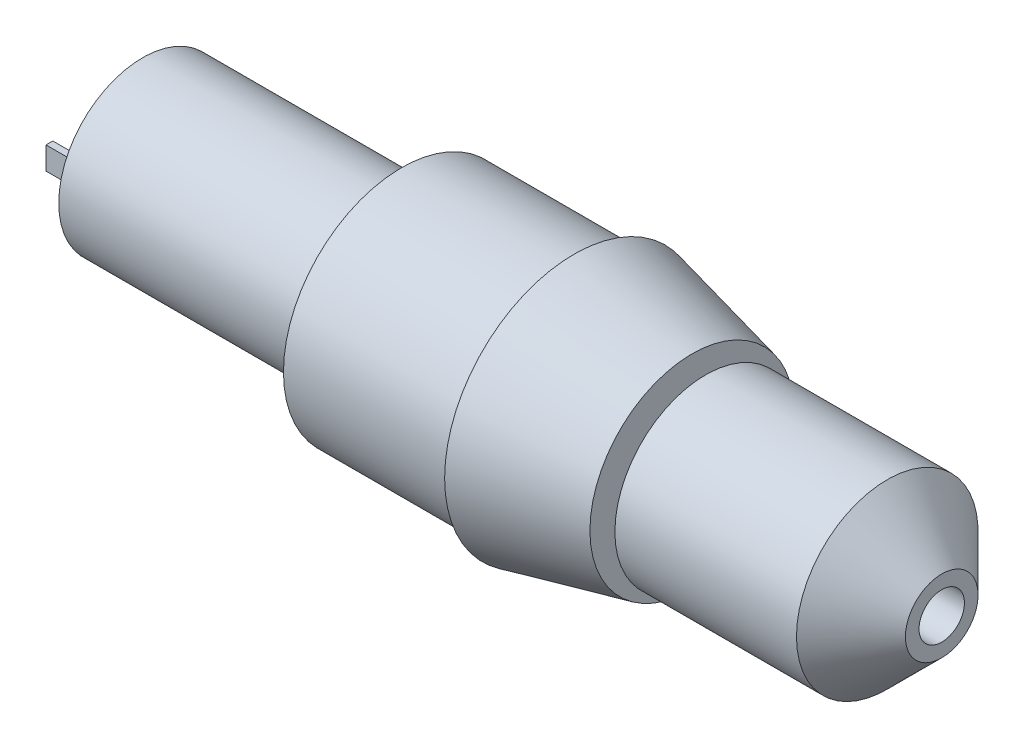
ISO-10303-21;
HEADER;
FILE_DESCRIPTION(('STEP AP214'),'2;1');
FILE_NAME('part.step','',(''),(''),'','','');
FILE_SCHEMA(('AUTOMOTIVE_DESIGN { 1 0 10303 214 1 1 1 1 }'));
ENDSEC;
DATA;
#1=APPLICATION_CONTEXT('core data for automotive mechanical design processes');
#2=APPLICATION_PROTOCOL_DEFINITION('international standard','automotive_design',2000,#1);
#3=PRODUCT_CONTEXT('',#1,'mechanical');
#4=PRODUCT('Part','Part','',(#3));
#5=PRODUCT_RELATED_PRODUCT_CATEGORY('part','',(#4));
#6=PRODUCT_DEFINITION_FORMATION('','',#4);
#7=PRODUCT_DEFINITION_CONTEXT('part definition',#1,'design');
#8=PRODUCT_DEFINITION('design','',#6,#7);
#9=PRODUCT_DEFINITION_SHAPE('','',#8);
#10=(LENGTH_UNIT() NAMED_UNIT(*) SI_UNIT(.MILLI.,.METRE.));
#11=(NAMED_UNIT(*) PLANE_ANGLE_UNIT() SI_UNIT($,.RADIAN.));
#12=(NAMED_UNIT(*) SI_UNIT($,.STERADIAN.) SOLID_ANGLE_UNIT());
#13=UNCERTAINTY_MEASURE_WITH_UNIT(LENGTH_MEASURE(1.E-05),#10,'distance_accuracy_value','');
#14=(GEOMETRIC_REPRESENTATION_CONTEXT(3) GLOBAL_UNCERTAINTY_ASSIGNED_CONTEXT((#13)) GLOBAL_UNIT_ASSIGNED_CONTEXT((#10,
#11,#12)) REPRESENTATION_CONTEXT('',''));
#15=CARTESIAN_POINT('',(0.,0.,0.));
#16=DIRECTION('',(0.,0.,1.));
#17=DIRECTION('',(1.,0.,0.));
#18=AXIS2_PLACEMENT_3D('',#15,#16,#17);
#19=CARTESIAN_POINT('',(0.,0.,0.));
#20=DIRECTION('',(1.,0.,0.));
#21=DIRECTION('',(0.,0.,-1.));
#22=AXIS2_PLACEMENT_3D('',#19,#20,#21);
#23=PLANE('',#22);
#24=DIRECTION('',(0.,1.,0.));
#25=VECTOR('',#24,1.);
#26=CARTESIAN_POINT('',(0.,-2.5,-9.80665286859409));
#27=LINE('',#26,#25);
#28=CARTESIAN_POINT('',(0.,-2.5,-9.80665286859409));
#29=VERTEX_POINT('',#28);
#30=CARTESIAN_POINT('',(0.,2.5,-9.80665286859409));
#31=VERTEX_POINT('',#30);
#32=EDGE_CURVE('E120',#29,#31,#27,.T.);
#33=ORIENTED_EDGE('',*,*,#32,.F.);
#34=DIRECTION('',(0.,0.,1.));
#35=VECTOR('',#34,1.);
#36=CARTESIAN_POINT('',(0.,-2.5,-11.3066528685941));
#37=LINE('',#36,#35);
#38=CARTESIAN_POINT('',(0.,-2.5,-11.3066528685941));
#39=VERTEX_POINT('',#38);
#40=EDGE_CURVE('E133',#39,#29,#37,.T.);
#41=ORIENTED_EDGE('',*,*,#40,.F.);
#42=DIRECTION('',(0.,-1.,0.));
#43=VECTOR('',#42,1.);
#44=CARTESIAN_POINT('',(0.,-2.5,-11.3066528685941));
#45=LINE('',#44,#43);
#46=CARTESIAN_POINT('',(0.,2.5,-11.3066528685941));
#47=VERTEX_POINT('',#46);
#48=EDGE_CURVE('E142',#47,#39,#45,.T.);
#49=ORIENTED_EDGE('',*,*,#48,.F.);
#50=DIRECTION('',(0.,0.,-1.));
#51=VECTOR('',#50,1.);
#52=CARTESIAN_POINT('',(0.,2.5,-11.3066528685941));
#53=LINE('',#52,#51);
#54=EDGE_CURVE('E123',#31,#47,#53,.T.);
#55=ORIENTED_EDGE('',*,*,#54,.F.);
#56=EDGE_LOOP('',(#33,#41,#49,#55));
#57=FACE_BOUND('',#56,.T.);
#58=CARTESIAN_POINT('',(0.,0.,0.));
#59=DIRECTION('',(-1.,0.,0.));
#60=DIRECTION('',(0.,0.,1.));
#61=AXIS2_PLACEMENT_3D('',#58,#59,#60);
#62=CIRCLE('',#61,18.5);
#63=CARTESIAN_POINT('',(0.,0.,18.5));
#64=VERTEX_POINT('',#63);
#65=EDGE_CURVE('E11',#64,#64,#62,.T.);
#66=ORIENTED_EDGE('',*,*,#65,.T.);
#67=EDGE_LOOP('',(#66));
#68=FACE_BOUND('',#67,.T.);
#69=DIRECTION('',(0.,1.,0.));
#70=VECTOR('',#69,1.);
#71=CARTESIAN_POINT('',(0.,-2.5,11.3066528685941));
#72=LINE('',#71,#70);
#73=CARTESIAN_POINT('',(0.,-2.5,11.3066528685941));
#74=VERTEX_POINT('',#73);
#75=CARTESIAN_POINT('',(0.,2.5,11.3066528685941));
#76=VERTEX_POINT('',#75);
#77=EDGE_CURVE('E119',#74,#76,#72,.T.);
#78=ORIENTED_EDGE('',*,*,#77,.F.);
#79=DIRECTION('',(0.,0.,1.));
#80=VECTOR('',#79,1.);
#81=CARTESIAN_POINT('',(0.,-2.5,11.3066528685941));
#82=LINE('',#81,#80);
#83=CARTESIAN_POINT('',(0.,-2.5,9.80665286859409));
#84=VERTEX_POINT('',#83);
#85=EDGE_CURVE('E116',#84,#74,#82,.T.);
#86=ORIENTED_EDGE('',*,*,#85,.F.);
#87=DIRECTION('',(0.,-1.,0.));
#88=VECTOR('',#87,1.);
#89=CARTESIAN_POINT('',(0.,-2.5,9.80665286859409));
#90=LINE('',#89,#88);
#91=CARTESIAN_POINT('',(0.,2.5,9.80665286859409));
#92=VERTEX_POINT('',#91);
#93=EDGE_CURVE('E54',#92,#84,#90,.T.);
#94=ORIENTED_EDGE('',*,*,#93,.F.);
#95=DIRECTION('',(0.,0.,-1.));
#96=VECTOR('',#95,1.);
#97=CARTESIAN_POINT('',(0.,2.5,11.3066528685941));
#98=LINE('',#97,#96);
#99=EDGE_CURVE('E49',#76,#92,#98,.T.);
#100=ORIENTED_EDGE('',*,*,#99,.F.);
#101=EDGE_LOOP('',(#78,#86,#94,#100));
#102=FACE_BOUND('',#101,.T.);
#103=ADVANCED_FACE('F35',(#57,#68,#102),#23,.F.);
#104=CARTESIAN_POINT('',(0.,0.,0.));
#105=DIRECTION('',(-1.,0.,0.));
#106=DIRECTION('',(0.,0.,1.));
#107=AXIS2_PLACEMENT_3D('',#104,#105,#106);
#108=CYLINDRICAL_SURFACE('',#107,18.5);
#109=ORIENTED_EDGE('',*,*,#65,.F.);
#110=EDGE_LOOP('',(#109));
#111=FACE_BOUND('',#110,.T.);
#112=CARTESIAN_POINT('',(57.,0.,0.));
#113=DIRECTION('',(-1.,0.,0.));
#114=DIRECTION('',(0.,0.,1.));
#115=AXIS2_PLACEMENT_3D('',#112,#113,#114);
#116=CIRCLE('',#115,18.5);
#117=CARTESIAN_POINT('',(57.,0.,18.5));
#118=VERTEX_POINT('',#117);
#119=EDGE_CURVE('E42',#118,#118,#116,.T.);
#120=ORIENTED_EDGE('',*,*,#119,.T.);
#121=EDGE_LOOP('',(#120));
#122=FACE_BOUND('',#121,.T.);
#123=ADVANCED_FACE('F193',(#111,#122),#108,.T.);
#124=CARTESIAN_POINT('',(57.,18.5,0.));
#125=DIRECTION('',(1.,0.,0.));
#126=DIRECTION('',(0.,0.,-1.));
#127=AXIS2_PLACEMENT_3D('',#124,#125,#126);
#128=PLANE('',#127);
#129=ORIENTED_EDGE('',*,*,#119,.F.);
#130=EDGE_LOOP('',(#129));
#131=FACE_BOUND('',#130,.T.);
#132=CARTESIAN_POINT('',(57.,0.,0.));
#133=DIRECTION('',(-1.,0.,0.));
#134=DIRECTION('',(0.,0.,1.));
#135=AXIS2_PLACEMENT_3D('',#132,#133,#134);
#136=CIRCLE('',#135,26.);
#137=CARTESIAN_POINT('',(57.,0.,26.));
#138=VERTEX_POINT('',#137);
#139=EDGE_CURVE('E188',#138,#138,#136,.T.);
#140=ORIENTED_EDGE('',*,*,#139,.T.);
#141=EDGE_LOOP('',(#140));
#142=FACE_BOUND('',#141,.T.);
#143=ADVANCED_FACE('F195',(#131,#142),#128,.F.);
#144=CARTESIAN_POINT('',(0.,0.,0.));
#145=DIRECTION('',(-1.,0.,0.));
#146=DIRECTION('',(0.,0.,1.));
#147=AXIS2_PLACEMENT_3D('',#144,#145,#146);
#148=CYLINDRICAL_SURFACE('',#147,26.);
#149=ORIENTED_EDGE('',*,*,#139,.F.);
#150=EDGE_LOOP('',(#149));
#151=FACE_BOUND('',#150,.T.);
#152=CARTESIAN_POINT('',(95.,0.,0.));
#153=DIRECTION('',(-1.,0.,0.));
#154=DIRECTION('',(0.,0.,1.));
#155=AXIS2_PLACEMENT_3D('',#152,#153,#154);
#156=CIRCLE('',#155,26.);
#157=CARTESIAN_POINT('',(95.,0.,26.));
#158=VERTEX_POINT('',#157);
#159=EDGE_CURVE('E185',#158,#158,#156,.T.);
#160=ORIENTED_EDGE('',*,*,#159,.T.);
#161=EDGE_LOOP('',(#160));
#162=FACE_BOUND('',#161,.T.);
#163=ADVANCED_FACE('F198',(#151,#162),#148,.T.);
#164=CARTESIAN_POINT('',(95.,26.,0.));
#165=DIRECTION('',(1.,0.,0.));
#166=DIRECTION('',(0.,0.,-1.));
#167=AXIS2_PLACEMENT_3D('',#164,#165,#166);
#168=PLANE('',#167);
#169=ORIENTED_EDGE('',*,*,#159,.F.);
#170=EDGE_LOOP('',(#169));
#171=FACE_BOUND('',#170,.T.);
#172=CARTESIAN_POINT('',(95.,0.,0.));
#173=DIRECTION('',(-1.,0.,0.));
#174=DIRECTION('',(0.,0.,1.));
#175=AXIS2_PLACEMENT_3D('',#172,#173,#174);
#176=CIRCLE('',#175,28.5);
#177=CARTESIAN_POINT('',(95.,0.,28.5));
#178=VERTEX_POINT('',#177);
#179=EDGE_CURVE('E182',#178,#178,#176,.T.);
#180=ORIENTED_EDGE('',*,*,#179,.T.);
#181=EDGE_LOOP('',(#180));
#182=FACE_BOUND('',#181,.T.);
#183=ADVANCED_FACE('F204',(#171,#182),#168,.F.);
#184=CARTESIAN_POINT('',(121.,0.,0.));
#185=DIRECTION('',(-1.,0.,0.));
#186=DIRECTION('',(0.,0.,1.));
#187=AXIS2_PLACEMENT_3D('',#184,#185,#186);
#188=CONICAL_SURFACE('',#187,22.5,0.226798848053886);
#189=ORIENTED_EDGE('',*,*,#179,.F.);
#190=EDGE_LOOP('',(#189));
#191=FACE_BOUND('',#190,.T.);
#192=CARTESIAN_POINT('',(121.,0.,0.));
#193=DIRECTION('',(-1.,0.,0.));
#194=DIRECTION('',(0.,0.,1.));
#195=AXIS2_PLACEMENT_3D('',#192,#193,#194);
#196=CIRCLE('',#195,22.5);
#197=CARTESIAN_POINT('',(121.,0.,22.5));
#198=VERTEX_POINT('',#197);
#199=EDGE_CURVE('E179',#198,#198,#196,.T.);
#200=ORIENTED_EDGE('',*,*,#199,.T.);
#201=EDGE_LOOP('',(#200));
#202=FACE_BOUND('',#201,.T.);
#203=ADVANCED_FACE('F210',(#191,#202),#188,.T.);
#204=CARTESIAN_POINT('',(121.,22.5,0.));
#205=DIRECTION('',(-1.,0.,0.));
#206=DIRECTION('',(0.,0.,1.));
#207=AXIS2_PLACEMENT_3D('',#204,#205,#206);
#208=PLANE('',#207);
#209=ORIENTED_EDGE('',*,*,#199,.F.);
#210=EDGE_LOOP('',(#209));
#211=FACE_BOUND('',#210,.T.);
#212=CARTESIAN_POINT('',(121.,0.,0.));
#213=DIRECTION('',(-1.,0.,0.));
#214=DIRECTION('',(0.,0.,1.));
#215=AXIS2_PLACEMENT_3D('',#212,#213,#214);
#216=CIRCLE('',#215,6.);
#217=CARTESIAN_POINT('',(121.,0.,6.));
#218=VERTEX_POINT('',#217);
#219=EDGE_CURVE('E176',#218,#218,#216,.T.);
#220=ORIENTED_EDGE('',*,*,#219,.T.);
#221=EDGE_LOOP('',(#220));
#222=FACE_BOUND('',#221,.T.);
#223=ADVANCED_FACE('F216',(#211,#222),#208,.F.);
#224=CARTESIAN_POINT('',(0.,0.,0.));
#225=DIRECTION('',(-1.,0.,0.));
#226=DIRECTION('',(0.,0.,1.));
#227=AXIS2_PLACEMENT_3D('',#224,#225,#226);
#228=CYLINDRICAL_SURFACE('',#227,6.);
#229=ORIENTED_EDGE('',*,*,#219,.F.);
#230=EDGE_LOOP('',(#229));
#231=FACE_BOUND('',#230,.T.);
#232=CARTESIAN_POINT('',(124.,0.,0.));
#233=DIRECTION('',(-1.,0.,0.));
#234=DIRECTION('',(0.,0.,1.));
#235=AXIS2_PLACEMENT_3D('',#232,#233,#234);
#236=CIRCLE('',#235,6.);
#237=CARTESIAN_POINT('',(124.,0.,6.));
#238=VERTEX_POINT('',#237);
#239=EDGE_CURVE('E173',#238,#238,#236,.T.);
#240=ORIENTED_EDGE('',*,*,#239,.T.);
#241=EDGE_LOOP('',(#240));
#242=FACE_BOUND('',#241,.T.);
#243=ADVANCED_FACE('F222',(#231,#242),#228,.T.);
#244=CARTESIAN_POINT('',(124.,6.,0.));
#245=DIRECTION('',(1.,0.,0.));
#246=DIRECTION('',(0.,0.,-1.));
#247=AXIS2_PLACEMENT_3D('',#244,#245,#246);
#248=PLANE('',#247);
#249=ORIENTED_EDGE('',*,*,#239,.F.);
#250=EDGE_LOOP('',(#249));
#251=FACE_BOUND('',#250,.T.);
#252=CARTESIAN_POINT('',(124.,0.,0.));
#253=DIRECTION('',(-1.,0.,0.));
#254=DIRECTION('',(0.,0.,1.));
#255=AXIS2_PLACEMENT_3D('',#252,#253,#254);
#256=CIRCLE('',#255,20.);
#257=CARTESIAN_POINT('',(124.,0.,20.));
#258=VERTEX_POINT('',#257);
#259=EDGE_CURVE('E170',#258,#258,#256,.T.);
#260=ORIENTED_EDGE('',*,*,#259,.T.);
#261=EDGE_LOOP('',(#260));
#262=FACE_BOUND('',#261,.T.);
#263=ADVANCED_FACE('F228',(#251,#262),#248,.F.);
#264=CARTESIAN_POINT('',(0.,0.,0.));
#265=DIRECTION('',(-1.,0.,0.));
#266=DIRECTION('',(0.,0.,1.));
#267=AXIS2_PLACEMENT_3D('',#264,#265,#266);
#268=CYLINDRICAL_SURFACE('',#267,20.);
#269=ORIENTED_EDGE('',*,*,#259,.F.);
#270=EDGE_LOOP('',(#269));
#271=FACE_BOUND('',#270,.T.);
#272=CARTESIAN_POINT('',(164.,0.,0.));
#273=DIRECTION('',(-1.,0.,0.));
#274=DIRECTION('',(0.,0.,1.));
#275=AXIS2_PLACEMENT_3D('',#272,#273,#274);
#276=CIRCLE('',#275,20.);
#277=CARTESIAN_POINT('',(164.,0.,20.));
#278=VERTEX_POINT('',#277);
#279=EDGE_CURVE('E167',#278,#278,#276,.T.);
#280=ORIENTED_EDGE('',*,*,#279,.T.);
#281=EDGE_LOOP('',(#280));
#282=FACE_BOUND('',#281,.T.);
#283=ADVANCED_FACE('F234',(#271,#282),#268,.T.);
#284=CARTESIAN_POINT('',(176.,0.,0.));
#285=DIRECTION('',(-1.,0.,0.));
#286=DIRECTION('',(0.,0.,1.));
#287=AXIS2_PLACEMENT_3D('',#284,#285,#286);
#288=CONICAL_SURFACE('',#287,7.99999999999995,0.78539816339745);
#289=ORIENTED_EDGE('',*,*,#279,.F.);
#290=EDGE_LOOP('',(#289));
#291=FACE_BOUND('',#290,.T.);
#292=CARTESIAN_POINT('',(176.,0.,0.));
#293=DIRECTION('',(-1.,0.,0.));
#294=DIRECTION('',(0.,0.,1.));
#295=AXIS2_PLACEMENT_3D('',#292,#293,#294);
#296=CIRCLE('',#295,7.99999999999995);
#297=CARTESIAN_POINT('',(176.,0.,7.99999999999995));
#298=VERTEX_POINT('',#297);
#299=EDGE_CURVE('E164',#298,#298,#296,.T.);
#300=ORIENTED_EDGE('',*,*,#299,.T.);
#301=EDGE_LOOP('',(#300));
#302=FACE_BOUND('',#301,.T.);
#303=ADVANCED_FACE('F240',(#291,#302),#288,.T.);
#304=CARTESIAN_POINT('',(176.,7.99999999999995,0.));
#305=DIRECTION('',(-1.,0.,0.));
#306=DIRECTION('',(0.,0.,1.));
#307=AXIS2_PLACEMENT_3D('',#304,#305,#306);
#308=PLANE('',#307);
#309=ORIENTED_EDGE('',*,*,#299,.F.);
#310=EDGE_LOOP('',(#309));
#311=FACE_BOUND('',#310,.T.);
#312=CARTESIAN_POINT('',(176.,0.,0.));
#313=DIRECTION('',(-1.,0.,0.));
#314=DIRECTION('',(0.,0.,1.));
#315=AXIS2_PLACEMENT_3D('',#312,#313,#314);
#316=CIRCLE('',#315,5.);
#317=CARTESIAN_POINT('',(176.,0.,5.));
#318=VERTEX_POINT('',#317);
#319=EDGE_CURVE('E161',#318,#318,#316,.T.);
#320=ORIENTED_EDGE('',*,*,#319,.T.);
#321=EDGE_LOOP('',(#320));
#322=FACE_BOUND('',#321,.T.);
#323=ADVANCED_FACE('F246',(#311,#322),#308,.F.);
#324=CARTESIAN_POINT('',(0.,0.,0.));
#325=DIRECTION('',(-1.,0.,0.));
#326=DIRECTION('',(0.,0.,1.));
#327=AXIS2_PLACEMENT_3D('',#324,#325,#326);
#328=CYLINDRICAL_SURFACE('',#327,5.);
#329=ORIENTED_EDGE('',*,*,#319,.F.);
#330=EDGE_LOOP('',(#329));
#331=FACE_BOUND('',#330,.T.);
#332=CARTESIAN_POINT('',(166.,0.,0.));
#333=DIRECTION('',(-1.,0.,0.));
#334=DIRECTION('',(0.,0.,1.));
#335=AXIS2_PLACEMENT_3D('',#332,#333,#334);
#336=CIRCLE('',#335,5.);
#337=CARTESIAN_POINT('',(166.,0.,5.));
#338=VERTEX_POINT('',#337);
#339=EDGE_CURVE('E158',#338,#338,#336,.T.);
#340=ORIENTED_EDGE('',*,*,#339,.T.);
#341=EDGE_LOOP('',(#340));
#342=FACE_BOUND('',#341,.T.);
#343=ADVANCED_FACE('F252',(#331,#342),#328,.F.);
#344=CARTESIAN_POINT('',(166.,5.,0.));
#345=DIRECTION('',(-1.,0.,0.));
#346=DIRECTION('',(0.,0.,1.));
#347=AXIS2_PLACEMENT_3D('',#344,#345,#346);
#348=PLANE('',#347);
#349=ORIENTED_EDGE('',*,*,#339,.F.);
#350=EDGE_LOOP('',(#349));
#351=FACE_BOUND('',#350,.T.);
#352=ADVANCED_FACE('F258',(#351),#348,.F.);
#353=CARTESIAN_POINT('',(-10.,-2.5,-9.80665286859409));
#354=DIRECTION('',(0.,0.,-1.));
#355=DIRECTION('',(-1.,0.,0.));
#356=AXIS2_PLACEMENT_3D('',#353,#354,#355);
#357=PLANE('',#356);
#358=ORIENTED_EDGE('',*,*,#32,.T.);
#359=DIRECTION('',(1.,0.,0.));
#360=VECTOR('',#359,1.);
#361=CARTESIAN_POINT('',(-10.,2.5,-9.80665286859409));
#362=LINE('',#361,#360);
#363=CARTESIAN_POINT('',(-10.,2.5,-9.80665286859409));
#364=VERTEX_POINT('',#363);
#365=EDGE_CURVE('E155',#364,#31,#362,.T.);
#366=ORIENTED_EDGE('',*,*,#365,.F.);
#367=DIRECTION('',(0.,1.,0.));
#368=VECTOR('',#367,1.);
#369=CARTESIAN_POINT('',(-10.,-2.5,-9.80665286859409));
#370=LINE('',#369,#368);
#371=CARTESIAN_POINT('',(-10.,-2.5,-9.80665286859409));
#372=VERTEX_POINT('',#371);
#373=EDGE_CURVE('E129',#372,#364,#370,.T.);
#374=ORIENTED_EDGE('',*,*,#373,.F.);
#375=DIRECTION('',(1.,0.,0.));
#376=VECTOR('',#375,1.);
#377=CARTESIAN_POINT('',(-10.,-2.5,-9.80665286859409));
#378=LINE('',#377,#376);
#379=EDGE_CURVE('E138',#372,#29,#378,.T.);
#380=ORIENTED_EDGE('',*,*,#379,.T.);
#381=EDGE_LOOP('',(#358,#366,#374,#380));
#382=FACE_BOUND('',#381,.T.);
#383=ADVANCED_FACE('F263',(#382),#357,.F.);
#384=CARTESIAN_POINT('',(-10.,2.5,-11.3066528685941));
#385=DIRECTION('',(0.,-1.,0.));
#386=DIRECTION('',(0.,0.,-1.));
#387=AXIS2_PLACEMENT_3D('',#384,#385,#386);
#388=PLANE('',#387);
#389=ORIENTED_EDGE('',*,*,#54,.T.);
#390=DIRECTION('',(1.,0.,0.));
#391=VECTOR('',#390,1.);
#392=CARTESIAN_POINT('',(-10.,2.5,-11.3066528685941));
#393=LINE('',#392,#391);
#394=CARTESIAN_POINT('',(-10.,2.5,-11.3066528685941));
#395=VERTEX_POINT('',#394);
#396=EDGE_CURVE('E152',#395,#47,#393,.T.);
#397=ORIENTED_EDGE('',*,*,#396,.F.);
#398=DIRECTION('',(0.,0.,-1.));
#399=VECTOR('',#398,1.);
#400=CARTESIAN_POINT('',(-10.,2.5,-11.3066528685941));
#401=LINE('',#400,#399);
#402=EDGE_CURVE('E132',#364,#395,#401,.T.);
#403=ORIENTED_EDGE('',*,*,#402,.F.);
#404=ORIENTED_EDGE('',*,*,#365,.T.);
#405=EDGE_LOOP('',(#389,#397,#403,#404));
#406=FACE_BOUND('',#405,.T.);
#407=ADVANCED_FACE('F268',(#406),#388,.F.);
#408=CARTESIAN_POINT('',(-10.,-2.5,-11.3066528685941));
#409=DIRECTION('',(0.,0.,1.));
#410=DIRECTION('',(1.,0.,0.));
#411=AXIS2_PLACEMENT_3D('',#408,#409,#410);
#412=PLANE('',#411);
#413=ORIENTED_EDGE('',*,*,#48,.T.);
#414=DIRECTION('',(1.,0.,0.));
#415=VECTOR('',#414,1.);
#416=CARTESIAN_POINT('',(-10.,-2.5,-11.3066528685941));
#417=LINE('',#416,#415);
#418=CARTESIAN_POINT('',(-10.,-2.5,-11.3066528685941));
#419=VERTEX_POINT('',#418);
#420=EDGE_CURVE('E149',#419,#39,#417,.T.);
#421=ORIENTED_EDGE('',*,*,#420,.F.);
#422=DIRECTION('',(0.,-1.,0.));
#423=VECTOR('',#422,1.);
#424=CARTESIAN_POINT('',(-10.,-2.5,-11.3066528685941));
#425=LINE('',#424,#423);
#426=EDGE_CURVE('E135',#395,#419,#425,.T.);
#427=ORIENTED_EDGE('',*,*,#426,.F.);
#428=ORIENTED_EDGE('',*,*,#396,.T.);
#429=EDGE_LOOP('',(#413,#421,#427,#428));
#430=FACE_BOUND('',#429,.T.);
#431=ADVANCED_FACE('F313',(#430),#412,.F.);
#432=CARTESIAN_POINT('',(-10.,-2.5,-11.3066528685941));
#433=DIRECTION('',(0.,1.,0.));
#434=DIRECTION('',(0.,0.,1.));
#435=AXIS2_PLACEMENT_3D('',#432,#433,#434);
#436=PLANE('',#435);
#437=ORIENTED_EDGE('',*,*,#40,.T.);
#438=ORIENTED_EDGE('',*,*,#379,.F.);
#439=DIRECTION('',(0.,0.,1.));
#440=VECTOR('',#439,1.);
#441=CARTESIAN_POINT('',(-10.,-2.5,-11.3066528685941));
#442=LINE('',#441,#440);
#443=EDGE_CURVE('E137',#419,#372,#442,.T.);
#444=ORIENTED_EDGE('',*,*,#443,.F.);
#445=ORIENTED_EDGE('',*,*,#420,.T.);
#446=EDGE_LOOP('',(#437,#438,#444,#445));
#447=FACE_BOUND('',#446,.T.);
#448=ADVANCED_FACE('F309',(#447),#436,.F.);
#449=CARTESIAN_POINT('',(-10.,0.,0.));
#450=DIRECTION('',(1.,0.,0.));
#451=DIRECTION('',(0.,0.,-1.));
#452=AXIS2_PLACEMENT_3D('',#449,#450,#451);
#453=PLANE('',#452);
#454=ORIENTED_EDGE('',*,*,#373,.T.);
#455=ORIENTED_EDGE('',*,*,#402,.T.);
#456=ORIENTED_EDGE('',*,*,#426,.T.);
#457=ORIENTED_EDGE('',*,*,#443,.T.);
#458=EDGE_LOOP('',(#454,#455,#456,#457));
#459=FACE_BOUND('',#458,.T.);
#460=ADVANCED_FACE('F306',(#459),#453,.F.);
#461=CARTESIAN_POINT('',(-10.,-2.5,11.3066528685941));
#462=DIRECTION('',(0.,0.,-1.));
#463=DIRECTION('',(-1.,0.,0.));
#464=AXIS2_PLACEMENT_3D('',#461,#462,#463);
#465=PLANE('',#464);
#466=ORIENTED_EDGE('',*,*,#77,.T.);
#467=DIRECTION('',(1.,0.,0.));
#468=VECTOR('',#467,1.);
#469=CARTESIAN_POINT('',(-10.,2.5,11.3066528685941));
#470=LINE('',#469,#468);
#471=CARTESIAN_POINT('',(-10.,2.5,11.3066528685941));
#472=VERTEX_POINT('',#471);
#473=EDGE_CURVE('E100',#472,#76,#470,.T.);
#474=ORIENTED_EDGE('',*,*,#473,.F.);
#475=DIRECTION('',(0.,1.,0.));
#476=VECTOR('',#475,1.);
#477=CARTESIAN_POINT('',(-10.,-2.5,11.3066528685941));
#478=LINE('',#477,#476);
#479=CARTESIAN_POINT('',(-10.,-2.5,11.3066528685941));
#480=VERTEX_POINT('',#479);
#481=EDGE_CURVE('E107',#480,#472,#478,.T.);
#482=ORIENTED_EDGE('',*,*,#481,.F.);
#483=DIRECTION('',(1.,0.,0.));
#484=VECTOR('',#483,1.);
#485=CARTESIAN_POINT('',(-10.,-2.5,11.3066528685941));
#486=LINE('',#485,#484);
#487=EDGE_CURVE('E284',#480,#74,#486,.T.);
#488=ORIENTED_EDGE('',*,*,#487,.T.);
#489=EDGE_LOOP('',(#466,#474,#482,#488));
#490=FACE_BOUND('',#489,.T.);
#491=ADVANCED_FACE('F118',(#490),#465,.F.);
#492=CARTESIAN_POINT('',(-10.,2.5,11.3066528685941));
#493=DIRECTION('',(0.,-1.,0.));
#494=DIRECTION('',(0.,0.,-1.));
#495=AXIS2_PLACEMENT_3D('',#492,#493,#494);
#496=PLANE('',#495);
#497=ORIENTED_EDGE('',*,*,#99,.T.);
#498=DIRECTION('',(1.,0.,0.));
#499=VECTOR('',#498,1.);
#500=CARTESIAN_POINT('',(-10.,2.5,9.80665286859409));
#501=LINE('',#500,#499);
#502=CARTESIAN_POINT('',(-10.,2.5,9.80665286859409));
#503=VERTEX_POINT('',#502);
#504=EDGE_CURVE('E103',#503,#92,#501,.T.);
#505=ORIENTED_EDGE('',*,*,#504,.F.);
#506=DIRECTION('',(0.,0.,-1.));
#507=VECTOR('',#506,1.);
#508=CARTESIAN_POINT('',(-10.,2.5,11.3066528685941));
#509=LINE('',#508,#507);
#510=EDGE_CURVE('E96',#472,#503,#509,.T.);
#511=ORIENTED_EDGE('',*,*,#510,.F.);
#512=ORIENTED_EDGE('',*,*,#473,.T.);
#513=EDGE_LOOP('',(#497,#505,#511,#512));
#514=FACE_BOUND('',#513,.T.);
#515=ADVANCED_FACE('F98',(#514),#496,.F.);
#516=CARTESIAN_POINT('',(-10.,-2.5,9.80665286859409));
#517=DIRECTION('',(0.,0.,1.));
#518=DIRECTION('',(1.,0.,0.));
#519=AXIS2_PLACEMENT_3D('',#516,#517,#518);
#520=PLANE('',#519);
#521=ORIENTED_EDGE('',*,*,#93,.T.);
#522=DIRECTION('',(1.,0.,0.));
#523=VECTOR('',#522,1.);
#524=CARTESIAN_POINT('',(-10.,-2.5,9.80665286859409));
#525=LINE('',#524,#523);
#526=CARTESIAN_POINT('',(-10.,-2.5,9.80665286859409));
#527=VERTEX_POINT('',#526);
#528=EDGE_CURVE('E125',#527,#84,#525,.T.);
#529=ORIENTED_EDGE('',*,*,#528,.F.);
#530=DIRECTION('',(0.,-1.,0.));
#531=VECTOR('',#530,1.);
#532=CARTESIAN_POINT('',(-10.,-2.5,9.80665286859409));
#533=LINE('',#532,#531);
#534=EDGE_CURVE('E106',#503,#527,#533,.T.);
#535=ORIENTED_EDGE('',*,*,#534,.F.);
#536=ORIENTED_EDGE('',*,*,#504,.T.);
#537=EDGE_LOOP('',(#521,#529,#535,#536));
#538=FACE_BOUND('',#537,.T.);
#539=ADVANCED_FACE('F293',(#538),#520,.F.);
#540=CARTESIAN_POINT('',(-10.,-2.5,11.3066528685941));
#541=DIRECTION('',(0.,1.,0.));
#542=DIRECTION('',(0.,0.,1.));
#543=AXIS2_PLACEMENT_3D('',#540,#541,#542);
#544=PLANE('',#543);
#545=ORIENTED_EDGE('',*,*,#85,.T.);
#546=ORIENTED_EDGE('',*,*,#487,.F.);
#547=DIRECTION('',(0.,0.,1.));
#548=VECTOR('',#547,1.);
#549=CARTESIAN_POINT('',(-10.,-2.5,11.3066528685941));
#550=LINE('',#549,#548);
#551=EDGE_CURVE('E112',#527,#480,#550,.T.);
#552=ORIENTED_EDGE('',*,*,#551,.F.);
#553=ORIENTED_EDGE('',*,*,#528,.T.);
#554=EDGE_LOOP('',(#545,#546,#552,#553));
#555=FACE_BOUND('',#554,.T.);
#556=ADVANCED_FACE('F283',(#555),#544,.F.);
#557=CARTESIAN_POINT('',(-10.,0.,0.));
#558=DIRECTION('',(-1.,0.,0.));
#559=DIRECTION('',(0.,0.,1.));
#560=AXIS2_PLACEMENT_3D('',#557,#558,#559);
#561=PLANE('',#560);
#562=ORIENTED_EDGE('',*,*,#481,.T.);
#563=ORIENTED_EDGE('',*,*,#510,.T.);
#564=ORIENTED_EDGE('',*,*,#534,.T.);
#565=ORIENTED_EDGE('',*,*,#551,.T.);
#566=EDGE_LOOP('',(#562,#563,#564,#565));
#567=FACE_BOUND('',#566,.T.);
#568=ADVANCED_FACE('F110',(#567),#561,.T.);
#569=CLOSED_SHELL('',(#103,#123,#143,#163,#183,#203,#223,#243,#263,#283,#303,#323,#343,#352,
#383,#407,#431,#448,#460,#491,#515,#539,#556,#568));
#570=MANIFOLD_SOLID_BREP('B2',#569);
#571=ADVANCED_BREP_SHAPE_REPRESENTATION('',(#18,#570),#14);
#572=SHAPE_DEFINITION_REPRESENTATION(#9,#571);
ENDSEC;
END-ISO-10303-21;
